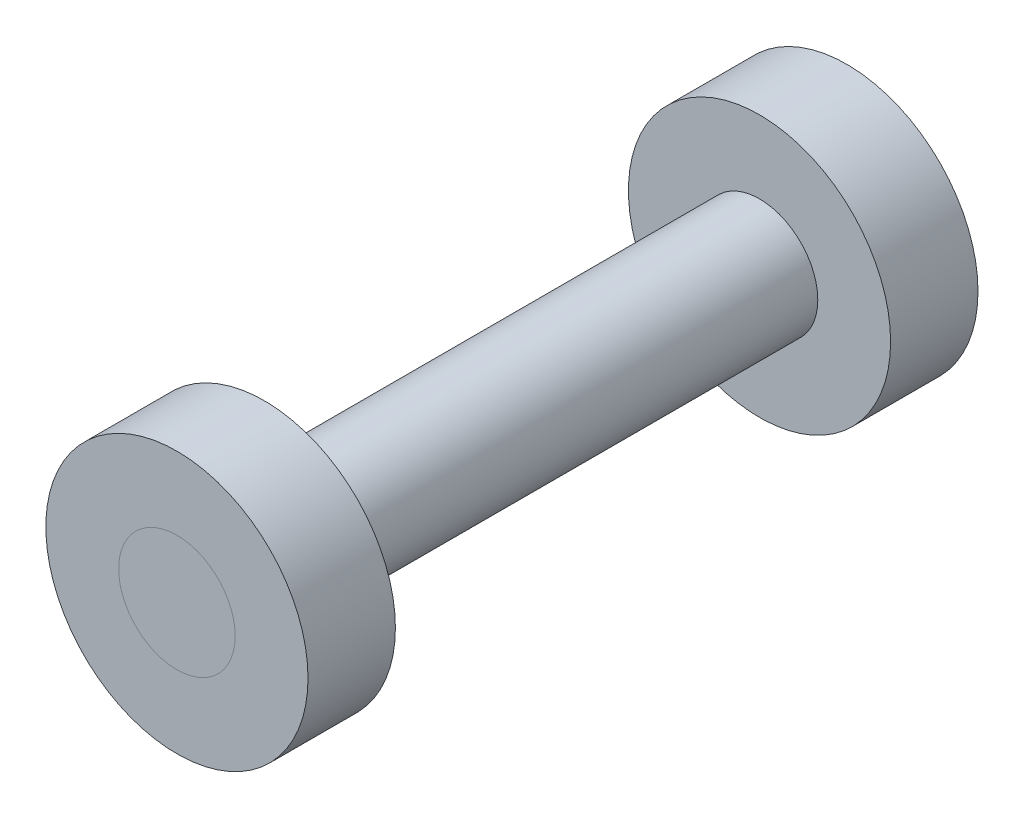
ISO-10303-21;
HEADER;
FILE_DESCRIPTION(('STEP AP214'),'2;1');
FILE_NAME('part.step','',(''),(''),'','','');
FILE_SCHEMA(('AUTOMOTIVE_DESIGN { 1 0 10303 214 1 1 1 1 }'));
ENDSEC;
DATA;
#1=APPLICATION_CONTEXT('core data for automotive mechanical design processes');
#2=APPLICATION_PROTOCOL_DEFINITION('international standard','automotive_design',2000,#1);
#3=PRODUCT_CONTEXT('',#1,'mechanical');
#4=PRODUCT('Part','Part','',(#3));
#5=PRODUCT_RELATED_PRODUCT_CATEGORY('part','',(#4));
#6=PRODUCT_DEFINITION_FORMATION('','',#4);
#7=PRODUCT_DEFINITION_CONTEXT('part definition',#1,'design');
#8=PRODUCT_DEFINITION('design','',#6,#7);
#9=PRODUCT_DEFINITION_SHAPE('','',#8);
#10=(LENGTH_UNIT() NAMED_UNIT(*) SI_UNIT(.MILLI.,.METRE.));
#11=(NAMED_UNIT(*) PLANE_ANGLE_UNIT() SI_UNIT($,.RADIAN.));
#12=(NAMED_UNIT(*) SI_UNIT($,.STERADIAN.) SOLID_ANGLE_UNIT());
#13=UNCERTAINTY_MEASURE_WITH_UNIT(LENGTH_MEASURE(1.E-05),#10,'distance_accuracy_value','');
#14=(GEOMETRIC_REPRESENTATION_CONTEXT(3) GLOBAL_UNCERTAINTY_ASSIGNED_CONTEXT((#13)) GLOBAL_UNIT_ASSIGNED_CONTEXT((#10,
#11,#12)) REPRESENTATION_CONTEXT('',''));
#15=CARTESIAN_POINT('',(0.,0.,0.));
#16=DIRECTION('',(0.,0.,1.));
#17=DIRECTION('',(1.,0.,0.));
#18=AXIS2_PLACEMENT_3D('',#15,#16,#17);
#19=CARTESIAN_POINT('',(0.,0.,23.));
#20=DIRECTION('',(0.,0.,1.));
#21=DIRECTION('',(1.,0.,0.));
#22=AXIS2_PLACEMENT_3D('',#19,#20,#21);
#23=PLANE('',#22);
#24=CARTESIAN_POINT('',(0.,0.,23.));
#25=DIRECTION('',(0.,0.,1.));
#26=DIRECTION('',(1.,0.,0.));
#27=AXIS2_PLACEMENT_3D('',#24,#25,#26);
#28=CIRCLE('',#27,4.5);
#29=CARTESIAN_POINT('',(4.5,0.,23.));
#30=VERTEX_POINT('',#29);
#31=EDGE_CURVE('E11',#30,#30,#28,.T.);
#32=ORIENTED_EDGE('',*,*,#31,.T.);
#33=EDGE_LOOP('',(#32));
#34=FACE_BOUND('',#33,.T.);
#35=CARTESIAN_POINT('',(0.,0.,23.));
#36=DIRECTION('',(0.,0.,1.));
#37=DIRECTION('',(1.,0.,0.));
#38=AXIS2_PLACEMENT_3D('',#35,#36,#37);
#39=CIRCLE('',#38,2.);
#40=CARTESIAN_POINT('',(2.,0.,23.));
#41=VERTEX_POINT('',#40);
#42=EDGE_CURVE('E56',#41,#41,#39,.T.);
#43=ORIENTED_EDGE('',*,*,#42,.F.);
#44=EDGE_LOOP('',(#43));
#45=FACE_BOUND('',#44,.T.);
#46=ADVANCED_FACE('F45',(#34,#45),#23,.T.);
#47=CARTESIAN_POINT('',(0.,0.,20.));
#48=DIRECTION('',(0.,0.,1.));
#49=DIRECTION('',(1.,0.,0.));
#50=AXIS2_PLACEMENT_3D('',#47,#48,#49);
#51=PLANE('',#50);
#52=CARTESIAN_POINT('',(0.,0.,20.));
#53=DIRECTION('',(0.,0.,1.));
#54=DIRECTION('',(1.,0.,0.));
#55=AXIS2_PLACEMENT_3D('',#52,#53,#54);
#56=CIRCLE('',#55,4.5);
#57=CARTESIAN_POINT('',(4.5,0.,20.));
#58=VERTEX_POINT('',#57);
#59=EDGE_CURVE('E49',#58,#58,#56,.T.);
#60=ORIENTED_EDGE('',*,*,#59,.F.);
#61=EDGE_LOOP('',(#60));
#62=FACE_BOUND('',#61,.T.);
#63=CARTESIAN_POINT('',(0.,0.,20.));
#64=DIRECTION('',(0.,0.,1.));
#65=DIRECTION('',(1.,0.,0.));
#66=AXIS2_PLACEMENT_3D('',#63,#64,#65);
#67=CIRCLE('',#66,2.);
#68=CARTESIAN_POINT('',(2.,0.,20.));
#69=VERTEX_POINT('',#68);
#70=EDGE_CURVE('E58',#69,#69,#67,.T.);
#71=ORIENTED_EDGE('',*,*,#70,.T.);
#72=EDGE_LOOP('',(#71));
#73=FACE_BOUND('',#72,.T.);
#74=ADVANCED_FACE('F68',(#62,#73),#51,.F.);
#75=CARTESIAN_POINT('',(0.,0.,23.));
#76=DIRECTION('',(0.,0.,-1.));
#77=DIRECTION('',(-1.,0.,0.));
#78=AXIS2_PLACEMENT_3D('',#75,#76,#77);
#79=CYLINDRICAL_SURFACE('',#78,4.5);
#80=ORIENTED_EDGE('',*,*,#31,.F.);
#81=EDGE_LOOP('',(#80));
#82=FACE_BOUND('',#81,.T.);
#83=ORIENTED_EDGE('',*,*,#59,.T.);
#84=EDGE_LOOP('',(#83));
#85=FACE_BOUND('',#84,.T.);
#86=ADVANCED_FACE('F47',(#82,#85),#79,.T.);
#87=CARTESIAN_POINT('',(0.,0.,23.));
#88=DIRECTION('',(0.,0.,-1.));
#89=DIRECTION('',(-1.,0.,0.));
#90=AXIS2_PLACEMENT_3D('',#87,#88,#89);
#91=CYLINDRICAL_SURFACE('',#90,2.);
#92=ORIENTED_EDGE('',*,*,#42,.T.);
#93=EDGE_LOOP('',(#92));
#94=FACE_BOUND('',#93,.T.);
#95=ORIENTED_EDGE('',*,*,#70,.F.);
#96=EDGE_LOOP('',(#95));
#97=FACE_BOUND('',#96,.T.);
#98=ADVANCED_FACE('F64',(#94,#97),#91,.F.);
#99=CLOSED_SHELL('',(#46,#74,#86,#98));
#100=MANIFOLD_SOLID_BREP('B2',#99);
#101=CARTESIAN_POINT('',(0.,0.,3.));
#102=DIRECTION('',(0.,0.,-1.));
#103=DIRECTION('',(-1.,0.,0.));
#104=AXIS2_PLACEMENT_3D('',#101,#102,#103);
#105=CYLINDRICAL_SURFACE('',#104,4.5);
#106=CARTESIAN_POINT('',(0.,0.,3.));
#107=DIRECTION('',(0.,0.,1.));
#108=DIRECTION('',(1.,0.,0.));
#109=AXIS2_PLACEMENT_3D('',#106,#107,#108);
#110=CIRCLE('',#109,4.5);
#111=CARTESIAN_POINT('',(4.5,0.,3.));
#112=VERTEX_POINT('',#111);
#113=EDGE_CURVE('E44',#112,#112,#110,.T.);
#114=ORIENTED_EDGE('',*,*,#113,.F.);
#115=EDGE_LOOP('',(#114));
#116=FACE_BOUND('',#115,.T.);
#117=CARTESIAN_POINT('',(0.,0.,0.));
#118=DIRECTION('',(0.,0.,1.));
#119=DIRECTION('',(1.,0.,0.));
#120=AXIS2_PLACEMENT_3D('',#117,#118,#119);
#121=CIRCLE('',#120,4.5);
#122=CARTESIAN_POINT('',(4.5,0.,0.));
#123=VERTEX_POINT('',#122);
#124=EDGE_CURVE('E110',#123,#123,#121,.T.);
#125=ORIENTED_EDGE('',*,*,#124,.T.);
#126=EDGE_LOOP('',(#125));
#127=FACE_BOUND('',#126,.T.);
#128=ADVANCED_FACE('F107',(#116,#127),#105,.T.);
#129=CARTESIAN_POINT('',(0.,0.,3.));
#130=DIRECTION('',(0.,0.,1.));
#131=DIRECTION('',(1.,0.,0.));
#132=AXIS2_PLACEMENT_3D('',#129,#130,#131);
#133=PLANE('',#132);
#134=CARTESIAN_POINT('',(0.,0.,3.));
#135=DIRECTION('',(0.,0.,1.));
#136=DIRECTION('',(1.,0.,0.));
#137=AXIS2_PLACEMENT_3D('',#134,#135,#136);
#138=CIRCLE('',#137,2.);
#139=CARTESIAN_POINT('',(2.,0.,3.));
#140=VERTEX_POINT('',#139);
#141=EDGE_CURVE('E119',#140,#140,#138,.F.);
#142=ORIENTED_EDGE('',*,*,#141,.T.);
#143=EDGE_LOOP('',(#142));
#144=FACE_BOUND('',#143,.T.);
#145=ORIENTED_EDGE('',*,*,#113,.T.);
#146=EDGE_LOOP('',(#145));
#147=FACE_BOUND('',#146,.T.);
#148=ADVANCED_FACE('F141',(#144,#147),#133,.T.);
#149=CARTESIAN_POINT('',(0.,0.,0.));
#150=DIRECTION('',(0.,0.,1.));
#151=DIRECTION('',(1.,0.,0.));
#152=AXIS2_PLACEMENT_3D('',#149,#150,#151);
#153=PLANE('',#152);
#154=ORIENTED_EDGE('',*,*,#124,.F.);
#155=EDGE_LOOP('',(#154));
#156=FACE_BOUND('',#155,.T.);
#157=ADVANCED_FACE('F133',(#156),#153,.F.);
#158=CARTESIAN_POINT('',(0.,0.,23.));
#159=DIRECTION('',(0.,0.,-1.));
#160=DIRECTION('',(-1.,0.,0.));
#161=AXIS2_PLACEMENT_3D('',#158,#159,#160);
#162=CYLINDRICAL_SURFACE('',#161,2.);
#163=ORIENTED_EDGE('',*,*,#141,.F.);
#164=EDGE_LOOP('',(#163));
#165=FACE_BOUND('',#164,.T.);
#166=CARTESIAN_POINT('',(0.,0.,23.));
#167=DIRECTION('',(0.,0.,1.));
#168=DIRECTION('',(1.,0.,0.));
#169=AXIS2_PLACEMENT_3D('',#166,#167,#168);
#170=CIRCLE('',#169,2.);
#171=CARTESIAN_POINT('',(2.,0.,23.));
#172=VERTEX_POINT('',#171);
#173=EDGE_CURVE('E124',#172,#172,#170,.T.);
#174=ORIENTED_EDGE('',*,*,#173,.F.);
#175=EDGE_LOOP('',(#174));
#176=FACE_BOUND('',#175,.T.);
#177=ADVANCED_FACE('F131',(#165,#176),#162,.T.);
#178=CARTESIAN_POINT('',(0.,0.,23.));
#179=DIRECTION('',(0.,0.,1.));
#180=DIRECTION('',(1.,0.,0.));
#181=AXIS2_PLACEMENT_3D('',#178,#179,#180);
#182=PLANE('',#181);
#183=ORIENTED_EDGE('',*,*,#173,.T.);
#184=EDGE_LOOP('',(#183));
#185=FACE_BOUND('',#184,.T.);
#186=ADVANCED_FACE('F129',(#185),#182,.T.);
#187=CLOSED_SHELL('',(#128,#148,#157,#177,#186));
#188=MANIFOLD_SOLID_BREP('B6',#187);
#189=ADVANCED_BREP_SHAPE_REPRESENTATION('',(#18,#100,#188),#14);
#190=SHAPE_DEFINITION_REPRESENTATION(#9,#189);
ENDSEC;
END-ISO-10303-21;
